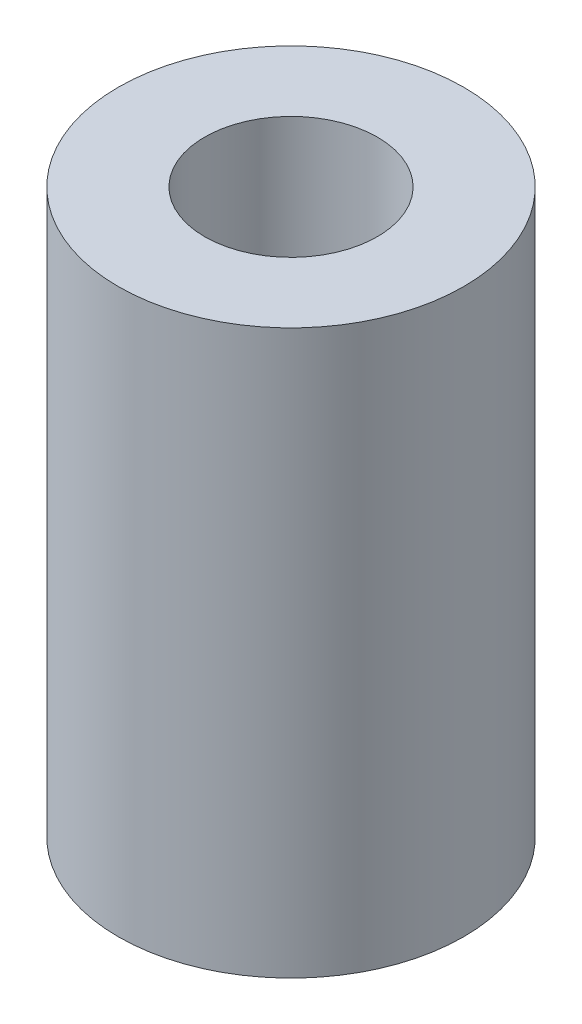
ISO-10303-21;
HEADER;
FILE_DESCRIPTION(('STEP AP214'),'2;1');
FILE_NAME('part.step','',(''),(''),'','','');
FILE_SCHEMA(('AUTOMOTIVE_DESIGN { 1 0 10303 214 1 1 1 1 }'));
ENDSEC;
DATA;
#1=APPLICATION_CONTEXT('core data for automotive mechanical design processes');
#2=APPLICATION_PROTOCOL_DEFINITION('international standard','automotive_design',2000,#1);
#3=PRODUCT_CONTEXT('',#1,'mechanical');
#4=PRODUCT('Part','Part','',(#3));
#5=PRODUCT_RELATED_PRODUCT_CATEGORY('part','',(#4));
#6=PRODUCT_DEFINITION_FORMATION('','',#4);
#7=PRODUCT_DEFINITION_CONTEXT('part definition',#1,'design');
#8=PRODUCT_DEFINITION('design','',#6,#7);
#9=PRODUCT_DEFINITION_SHAPE('','',#8);
#10=(LENGTH_UNIT() NAMED_UNIT(*) SI_UNIT(.MILLI.,.METRE.));
#11=(NAMED_UNIT(*) PLANE_ANGLE_UNIT() SI_UNIT($,.RADIAN.));
#12=(NAMED_UNIT(*) SI_UNIT($,.STERADIAN.) SOLID_ANGLE_UNIT());
#13=UNCERTAINTY_MEASURE_WITH_UNIT(LENGTH_MEASURE(1.E-05),#10,'distance_accuracy_value','');
#14=(GEOMETRIC_REPRESENTATION_CONTEXT(3) GLOBAL_UNCERTAINTY_ASSIGNED_CONTEXT((#13)) GLOBAL_UNIT_ASSIGNED_CONTEXT((#10,
#11,#12)) REPRESENTATION_CONTEXT('',''));
#15=CARTESIAN_POINT('',(0.,0.,0.));
#16=DIRECTION('',(0.,0.,1.));
#17=DIRECTION('',(1.,0.,0.));
#18=AXIS2_PLACEMENT_3D('',#15,#16,#17);
#19=CARTESIAN_POINT('',(0.,15.,0.));
#20=DIRECTION('',(0.,1.,0.));
#21=DIRECTION('',(0.,0.,1.));
#22=AXIS2_PLACEMENT_3D('',#19,#20,#21);
#23=PLANE('',#22);
#24=CARTESIAN_POINT('',(0.,15.,0.));
#25=DIRECTION('',(0.,1.,0.));
#26=DIRECTION('',(0.,0.,1.));
#27=AXIS2_PLACEMENT_3D('',#24,#25,#26);
#28=CIRCLE('',#27,4.6);
#29=CARTESIAN_POINT('',(0.,15.,4.6));
#30=VERTEX_POINT('',#29);
#31=EDGE_CURVE('E10',#30,#30,#28,.T.);
#32=ORIENTED_EDGE('',*,*,#31,.T.);
#33=EDGE_LOOP('',(#32));
#34=FACE_BOUND('',#33,.T.);
#35=CARTESIAN_POINT('',(0.,15.,0.));
#36=DIRECTION('',(0.,1.,0.));
#37=DIRECTION('',(0.,0.,1.));
#38=AXIS2_PLACEMENT_3D('',#35,#36,#37);
#39=CIRCLE('',#38,2.3);
#40=CARTESIAN_POINT('',(0.,15.,2.3));
#41=VERTEX_POINT('',#40);
#42=EDGE_CURVE('E44',#41,#41,#39,.T.);
#43=ORIENTED_EDGE('',*,*,#42,.F.);
#44=EDGE_LOOP('',(#43));
#45=FACE_BOUND('',#44,.T.);
#46=ADVANCED_FACE('F33',(#34,#45),#23,.T.);
#47=CARTESIAN_POINT('',(0.,0.,0.));
#48=DIRECTION('',(0.,1.,0.));
#49=DIRECTION('',(0.,0.,1.));
#50=AXIS2_PLACEMENT_3D('',#47,#48,#49);
#51=PLANE('',#50);
#52=CARTESIAN_POINT('',(0.,0.,0.));
#53=DIRECTION('',(0.,1.,0.));
#54=DIRECTION('',(0.,0.,1.));
#55=AXIS2_PLACEMENT_3D('',#52,#53,#54);
#56=CIRCLE('',#55,4.6);
#57=CARTESIAN_POINT('',(0.,0.,4.6));
#58=VERTEX_POINT('',#57);
#59=EDGE_CURVE('E37',#58,#58,#56,.T.);
#60=ORIENTED_EDGE('',*,*,#59,.F.);
#61=EDGE_LOOP('',(#60));
#62=FACE_BOUND('',#61,.T.);
#63=CARTESIAN_POINT('',(0.,0.,0.));
#64=DIRECTION('',(0.,1.,0.));
#65=DIRECTION('',(0.,0.,1.));
#66=AXIS2_PLACEMENT_3D('',#63,#64,#65);
#67=CIRCLE('',#66,2.3);
#68=CARTESIAN_POINT('',(0.,0.,2.3));
#69=VERTEX_POINT('',#68);
#70=EDGE_CURVE('E46',#69,#69,#67,.T.);
#71=ORIENTED_EDGE('',*,*,#70,.T.);
#72=EDGE_LOOP('',(#71));
#73=FACE_BOUND('',#72,.T.);
#74=ADVANCED_FACE('F56',(#62,#73),#51,.F.);
#75=CARTESIAN_POINT('',(0.,15.,0.));
#76=DIRECTION('',(0.,-1.,0.));
#77=DIRECTION('',(0.,0.,-1.));
#78=AXIS2_PLACEMENT_3D('',#75,#76,#77);
#79=CYLINDRICAL_SURFACE('',#78,4.6);
#80=ORIENTED_EDGE('',*,*,#31,.F.);
#81=EDGE_LOOP('',(#80));
#82=FACE_BOUND('',#81,.T.);
#83=ORIENTED_EDGE('',*,*,#59,.T.);
#84=EDGE_LOOP('',(#83));
#85=FACE_BOUND('',#84,.T.);
#86=ADVANCED_FACE('F35',(#82,#85),#79,.T.);
#87=CARTESIAN_POINT('',(0.,15.,0.));
#88=DIRECTION('',(0.,-1.,0.));
#89=DIRECTION('',(0.,0.,-1.));
#90=AXIS2_PLACEMENT_3D('',#87,#88,#89);
#91=CYLINDRICAL_SURFACE('',#90,2.3);
#92=ORIENTED_EDGE('',*,*,#42,.T.);
#93=EDGE_LOOP('',(#92));
#94=FACE_BOUND('',#93,.T.);
#95=ORIENTED_EDGE('',*,*,#70,.F.);
#96=EDGE_LOOP('',(#95));
#97=FACE_BOUND('',#96,.T.);
#98=ADVANCED_FACE('F52',(#94,#97),#91,.F.);
#99=CLOSED_SHELL('',(#46,#74,#86,#98));
#100=MANIFOLD_SOLID_BREP('B2',#99);
#101=ADVANCED_BREP_SHAPE_REPRESENTATION('',(#18,#100),#14);
#102=SHAPE_DEFINITION_REPRESENTATION(#9,#101);
ENDSEC;
END-ISO-10303-21;
